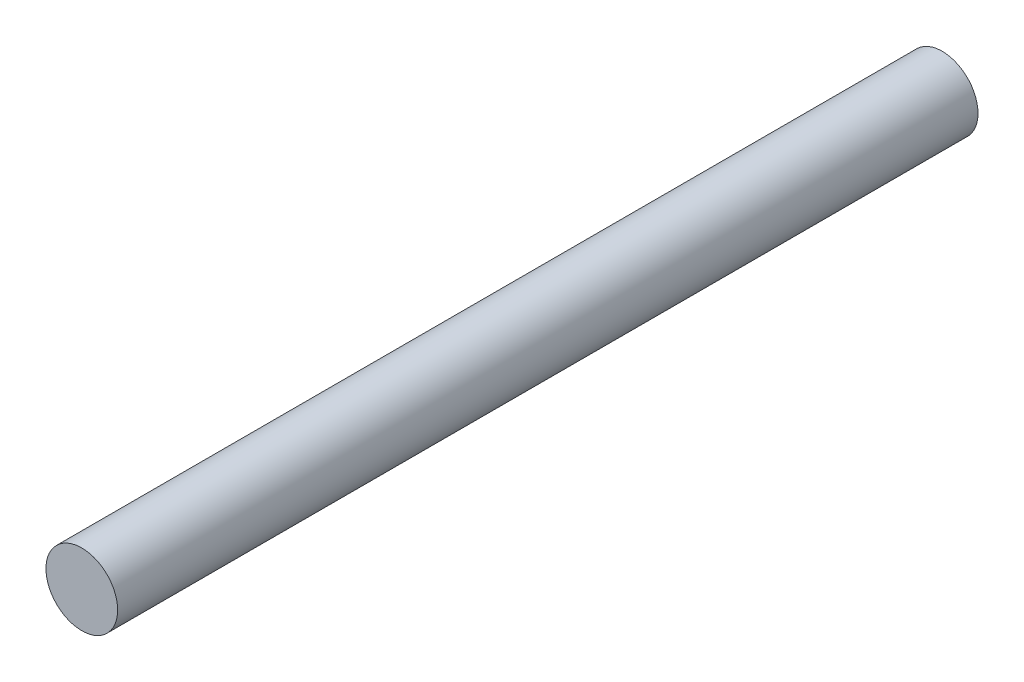
ISO-10303-21;
HEADER;
FILE_DESCRIPTION(('STEP AP214'),'2;1');
FILE_NAME('part.step','',(''),(''),'','','');
FILE_SCHEMA(('AUTOMOTIVE_DESIGN { 1 0 10303 214 1 1 1 1 }'));
ENDSEC;
DATA;
#1=APPLICATION_CONTEXT('core data for automotive mechanical design processes');
#2=APPLICATION_PROTOCOL_DEFINITION('international standard','automotive_design',2000,#1);
#3=PRODUCT_CONTEXT('',#1,'mechanical');
#4=PRODUCT('Part','Part','',(#3));
#5=PRODUCT_RELATED_PRODUCT_CATEGORY('part','',(#4));
#6=PRODUCT_DEFINITION_FORMATION('','',#4);
#7=PRODUCT_DEFINITION_CONTEXT('part definition',#1,'design');
#8=PRODUCT_DEFINITION('design','',#6,#7);
#9=PRODUCT_DEFINITION_SHAPE('','',#8);
#10=(LENGTH_UNIT() NAMED_UNIT(*) SI_UNIT(.MILLI.,.METRE.));
#11=(NAMED_UNIT(*) PLANE_ANGLE_UNIT() SI_UNIT($,.RADIAN.));
#12=(NAMED_UNIT(*) SI_UNIT($,.STERADIAN.) SOLID_ANGLE_UNIT());
#13=UNCERTAINTY_MEASURE_WITH_UNIT(LENGTH_MEASURE(1.E-05),#10,'distance_accuracy_value','');
#14=(GEOMETRIC_REPRESENTATION_CONTEXT(3) GLOBAL_UNCERTAINTY_ASSIGNED_CONTEXT((#13)) GLOBAL_UNIT_ASSIGNED_CONTEXT((#10,
#11,#12)) REPRESENTATION_CONTEXT('',''));
#15=CARTESIAN_POINT('',(0.,0.,0.));
#16=DIRECTION('',(0.,0.,1.));
#17=DIRECTION('',(1.,0.,0.));
#18=AXIS2_PLACEMENT_3D('',#15,#16,#17);
#19=CARTESIAN_POINT('',(0.,0.,60.));
#20=DIRECTION('',(0.,0.,-1.));
#21=DIRECTION('',(-1.,0.,0.));
#22=AXIS2_PLACEMENT_3D('',#19,#20,#21);
#23=CYLINDRICAL_SURFACE('',#22,2.5);
#24=CARTESIAN_POINT('',(0.,0.,60.));
#25=DIRECTION('',(0.,0.,1.));
#26=DIRECTION('',(1.,0.,0.));
#27=AXIS2_PLACEMENT_3D('',#24,#25,#26);
#28=CIRCLE('',#27,2.5);
#29=CARTESIAN_POINT('',(2.5,0.,60.));
#30=VERTEX_POINT('',#29);
#31=EDGE_CURVE('E10',#30,#30,#28,.T.);
#32=ORIENTED_EDGE('',*,*,#31,.F.);
#33=EDGE_LOOP('',(#32));
#34=FACE_BOUND('',#33,.T.);
#35=CARTESIAN_POINT('',(0.,0.,0.));
#36=DIRECTION('',(0.,0.,1.));
#37=DIRECTION('',(1.,0.,0.));
#38=AXIS2_PLACEMENT_3D('',#35,#36,#37);
#39=CIRCLE('',#38,2.5);
#40=CARTESIAN_POINT('',(2.5,0.,0.));
#41=VERTEX_POINT('',#40);
#42=EDGE_CURVE('E35',#41,#41,#39,.T.);
#43=ORIENTED_EDGE('',*,*,#42,.T.);
#44=EDGE_LOOP('',(#43));
#45=FACE_BOUND('',#44,.T.);
#46=ADVANCED_FACE('F32',(#34,#45),#23,.T.);
#47=CARTESIAN_POINT('',(0.,0.,60.));
#48=DIRECTION('',(0.,0.,1.));
#49=DIRECTION('',(1.,0.,0.));
#50=AXIS2_PLACEMENT_3D('',#47,#48,#49);
#51=PLANE('',#50);
#52=ORIENTED_EDGE('',*,*,#31,.T.);
#53=EDGE_LOOP('',(#52));
#54=FACE_BOUND('',#53,.T.);
#55=ADVANCED_FACE('F47',(#54),#51,.T.);
#56=CARTESIAN_POINT('',(0.,0.,0.));
#57=DIRECTION('',(0.,0.,1.));
#58=DIRECTION('',(1.,0.,0.));
#59=AXIS2_PLACEMENT_3D('',#56,#57,#58);
#60=PLANE('',#59);
#61=ORIENTED_EDGE('',*,*,#42,.F.);
#62=EDGE_LOOP('',(#61));
#63=FACE_BOUND('',#62,.T.);
#64=ADVANCED_FACE('F45',(#63),#60,.F.);
#65=CLOSED_SHELL('',(#46,#55,#64));
#66=MANIFOLD_SOLID_BREP('B2',#65);
#67=ADVANCED_BREP_SHAPE_REPRESENTATION('',(#18,#66),#14);
#68=SHAPE_DEFINITION_REPRESENTATION(#9,#67);
ENDSEC;
END-ISO-10303-21;
